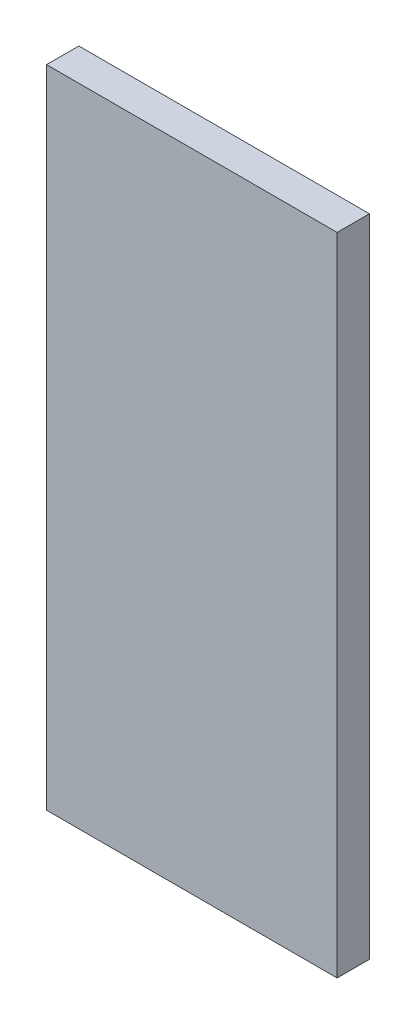
ISO-10303-21;
HEADER;
FILE_DESCRIPTION(('STEP AP214'),'2;1');
FILE_NAME('part.step','',(''),(''),'','','');
FILE_SCHEMA(('AUTOMOTIVE_DESIGN { 1 0 10303 214 1 1 1 1 }'));
ENDSEC;
DATA;
#1=APPLICATION_CONTEXT('core data for automotive mechanical design processes');
#2=APPLICATION_PROTOCOL_DEFINITION('international standard','automotive_design',2000,#1);
#3=PRODUCT_CONTEXT('',#1,'mechanical');
#4=PRODUCT('Part','Part','',(#3));
#5=PRODUCT_RELATED_PRODUCT_CATEGORY('part','',(#4));
#6=PRODUCT_DEFINITION_FORMATION('','',#4);
#7=PRODUCT_DEFINITION_CONTEXT('part definition',#1,'design');
#8=PRODUCT_DEFINITION('design','',#6,#7);
#9=PRODUCT_DEFINITION_SHAPE('','',#8);
#10=(LENGTH_UNIT() NAMED_UNIT(*) SI_UNIT(.MILLI.,.METRE.));
#11=(NAMED_UNIT(*) PLANE_ANGLE_UNIT() SI_UNIT($,.RADIAN.));
#12=(NAMED_UNIT(*) SI_UNIT($,.STERADIAN.) SOLID_ANGLE_UNIT());
#13=UNCERTAINTY_MEASURE_WITH_UNIT(LENGTH_MEASURE(1.E-05),#10,'distance_accuracy_value','');
#14=(GEOMETRIC_REPRESENTATION_CONTEXT(3) GLOBAL_UNCERTAINTY_ASSIGNED_CONTEXT((#13)) GLOBAL_UNIT_ASSIGNED_CONTEXT((#10,
#11,#12)) REPRESENTATION_CONTEXT('',''));
#15=CARTESIAN_POINT('',(0.,0.,0.));
#16=DIRECTION('',(0.,0.,1.));
#17=DIRECTION('',(1.,0.,0.));
#18=AXIS2_PLACEMENT_3D('',#15,#16,#17);
#19=CARTESIAN_POINT('',(22.5,-50.,5.));
#20=DIRECTION('',(-1.,0.,0.));
#21=DIRECTION('',(0.,0.,1.));
#22=AXIS2_PLACEMENT_3D('',#19,#20,#21);
#23=PLANE('',#22);
#24=DIRECTION('',(0.,1.,0.));
#25=VECTOR('',#24,1.);
#26=CARTESIAN_POINT('',(22.5,-50.,0.));
#27=LINE('',#26,#25);
#28=CARTESIAN_POINT('',(22.5,-50.,0.));
#29=VERTEX_POINT('',#28);
#30=CARTESIAN_POINT('',(22.5,50.,0.));
#31=VERTEX_POINT('',#30);
#32=EDGE_CURVE('E97',#29,#31,#27,.T.);
#33=ORIENTED_EDGE('',*,*,#32,.T.);
#34=DIRECTION('',(0.,0.,-1.));
#35=VECTOR('',#34,1.);
#36=CARTESIAN_POINT('',(22.5,50.,5.));
#37=LINE('',#36,#35);
#38=CARTESIAN_POINT('',(22.5,50.,5.));
#39=VERTEX_POINT('',#38);
#40=EDGE_CURVE('E11',#39,#31,#37,.T.);
#41=ORIENTED_EDGE('',*,*,#40,.F.);
#42=DIRECTION('',(0.,1.,0.));
#43=VECTOR('',#42,1.);
#44=CARTESIAN_POINT('',(22.5,-50.,5.));
#45=LINE('',#44,#43);
#46=CARTESIAN_POINT('',(22.5,-50.,5.));
#47=VERTEX_POINT('',#46);
#48=EDGE_CURVE('E85',#47,#39,#45,.T.);
#49=ORIENTED_EDGE('',*,*,#48,.F.);
#50=DIRECTION('',(0.,0.,-1.));
#51=VECTOR('',#50,1.);
#52=CARTESIAN_POINT('',(22.5,-50.,5.));
#53=LINE('',#52,#51);
#54=EDGE_CURVE('E93',#47,#29,#53,.T.);
#55=ORIENTED_EDGE('',*,*,#54,.T.);
#56=EDGE_LOOP('',(#33,#41,#49,#55));
#57=FACE_BOUND('',#56,.T.);
#58=ADVANCED_FACE('F34',(#57),#23,.F.);
#59=CARTESIAN_POINT('',(-22.5,50.,5.));
#60=DIRECTION('',(0.,-1.,0.));
#61=DIRECTION('',(0.,0.,-1.));
#62=AXIS2_PLACEMENT_3D('',#59,#60,#61);
#63=PLANE('',#62);
#64=DIRECTION('',(-1.,0.,0.));
#65=VECTOR('',#64,1.);
#66=CARTESIAN_POINT('',(-22.5,50.,0.));
#67=LINE('',#66,#65);
#68=CARTESIAN_POINT('',(-22.5,50.,0.));
#69=VERTEX_POINT('',#68);
#70=EDGE_CURVE('E89',#31,#69,#67,.T.);
#71=ORIENTED_EDGE('',*,*,#70,.T.);
#72=DIRECTION('',(0.,0.,-1.));
#73=VECTOR('',#72,1.);
#74=CARTESIAN_POINT('',(-22.5,50.,5.));
#75=LINE('',#74,#73);
#76=CARTESIAN_POINT('',(-22.5,50.,5.));
#77=VERTEX_POINT('',#76);
#78=EDGE_CURVE('E42',#77,#69,#75,.T.);
#79=ORIENTED_EDGE('',*,*,#78,.F.);
#80=DIRECTION('',(-1.,0.,0.));
#81=VECTOR('',#80,1.);
#82=CARTESIAN_POINT('',(-22.5,50.,5.));
#83=LINE('',#82,#81);
#84=EDGE_CURVE('E80',#39,#77,#83,.T.);
#85=ORIENTED_EDGE('',*,*,#84,.F.);
#86=ORIENTED_EDGE('',*,*,#40,.T.);
#87=EDGE_LOOP('',(#71,#79,#85,#86));
#88=FACE_BOUND('',#87,.T.);
#89=ADVANCED_FACE('F88',(#88),#63,.F.);
#90=CARTESIAN_POINT('',(-22.5,-50.,5.));
#91=DIRECTION('',(1.,0.,0.));
#92=DIRECTION('',(0.,0.,-1.));
#93=AXIS2_PLACEMENT_3D('',#90,#91,#92);
#94=PLANE('',#93);
#95=DIRECTION('',(0.,-1.,0.));
#96=VECTOR('',#95,1.);
#97=CARTESIAN_POINT('',(-22.5,-50.,0.));
#98=LINE('',#97,#96);
#99=CARTESIAN_POINT('',(-22.5,-50.,0.));
#100=VERTEX_POINT('',#99);
#101=EDGE_CURVE('E67',#69,#100,#98,.T.);
#102=ORIENTED_EDGE('',*,*,#101,.T.);
#103=DIRECTION('',(0.,0.,-1.));
#104=VECTOR('',#103,1.);
#105=CARTESIAN_POINT('',(-22.5,-50.,5.));
#106=LINE('',#105,#104);
#107=CARTESIAN_POINT('',(-22.5,-50.,5.));
#108=VERTEX_POINT('',#107);
#109=EDGE_CURVE('E90',#108,#100,#106,.T.);
#110=ORIENTED_EDGE('',*,*,#109,.F.);
#111=DIRECTION('',(0.,-1.,0.));
#112=VECTOR('',#111,1.);
#113=CARTESIAN_POINT('',(-22.5,-50.,5.));
#114=LINE('',#113,#112);
#115=EDGE_CURVE('E83',#77,#108,#114,.T.);
#116=ORIENTED_EDGE('',*,*,#115,.F.);
#117=ORIENTED_EDGE('',*,*,#78,.T.);
#118=EDGE_LOOP('',(#102,#110,#116,#117));
#119=FACE_BOUND('',#118,.T.);
#120=ADVANCED_FACE('F91',(#119),#94,.F.);
#121=CARTESIAN_POINT('',(-22.5,-50.,5.));
#122=DIRECTION('',(0.,1.,0.));
#123=DIRECTION('',(0.,0.,1.));
#124=AXIS2_PLACEMENT_3D('',#121,#122,#123);
#125=PLANE('',#124);
#126=DIRECTION('',(1.,0.,0.));
#127=VECTOR('',#126,1.);
#128=CARTESIAN_POINT('',(-22.5,-50.,0.));
#129=LINE('',#128,#127);
#130=EDGE_CURVE('E73',#100,#29,#129,.T.);
#131=ORIENTED_EDGE('',*,*,#130,.T.);
#132=ORIENTED_EDGE('',*,*,#54,.F.);
#133=DIRECTION('',(1.,0.,0.));
#134=VECTOR('',#133,1.);
#135=CARTESIAN_POINT('',(-22.5,-50.,5.));
#136=LINE('',#135,#134);
#137=EDGE_CURVE('E50',#108,#47,#136,.T.);
#138=ORIENTED_EDGE('',*,*,#137,.F.);
#139=ORIENTED_EDGE('',*,*,#109,.T.);
#140=EDGE_LOOP('',(#131,#132,#138,#139));
#141=FACE_BOUND('',#140,.T.);
#142=ADVANCED_FACE('F104',(#141),#125,.F.);
#143=CARTESIAN_POINT('',(0.,0.,5.));
#144=DIRECTION('',(0.,0.,-1.));
#145=DIRECTION('',(-1.,0.,0.));
#146=AXIS2_PLACEMENT_3D('',#143,#144,#145);
#147=PLANE('',#146);
#148=ORIENTED_EDGE('',*,*,#48,.T.);
#149=ORIENTED_EDGE('',*,*,#84,.T.);
#150=ORIENTED_EDGE('',*,*,#115,.T.);
#151=ORIENTED_EDGE('',*,*,#137,.T.);
#152=EDGE_LOOP('',(#148,#149,#150,#151));
#153=FACE_BOUND('',#152,.T.);
#154=ADVANCED_FACE('F81',(#153),#147,.F.);
#155=CARTESIAN_POINT('',(0.,0.,0.));
#156=DIRECTION('',(0.,0.,-1.));
#157=DIRECTION('',(-1.,0.,0.));
#158=AXIS2_PLACEMENT_3D('',#155,#156,#157);
#159=PLANE('',#158);
#160=ORIENTED_EDGE('',*,*,#32,.F.);
#161=ORIENTED_EDGE('',*,*,#130,.F.);
#162=ORIENTED_EDGE('',*,*,#101,.F.);
#163=ORIENTED_EDGE('',*,*,#70,.F.);
#164=EDGE_LOOP('',(#160,#161,#162,#163));
#165=FACE_BOUND('',#164,.T.);
#166=ADVANCED_FACE('F107',(#165),#159,.T.);
#167=CLOSED_SHELL('',(#58,#89,#120,#142,#154,#166));
#168=MANIFOLD_SOLID_BREP('B2',#167);
#169=ADVANCED_BREP_SHAPE_REPRESENTATION('',(#18,#168),#14);
#170=SHAPE_DEFINITION_REPRESENTATION(#9,#169);
ENDSEC;
END-ISO-10303-21;
